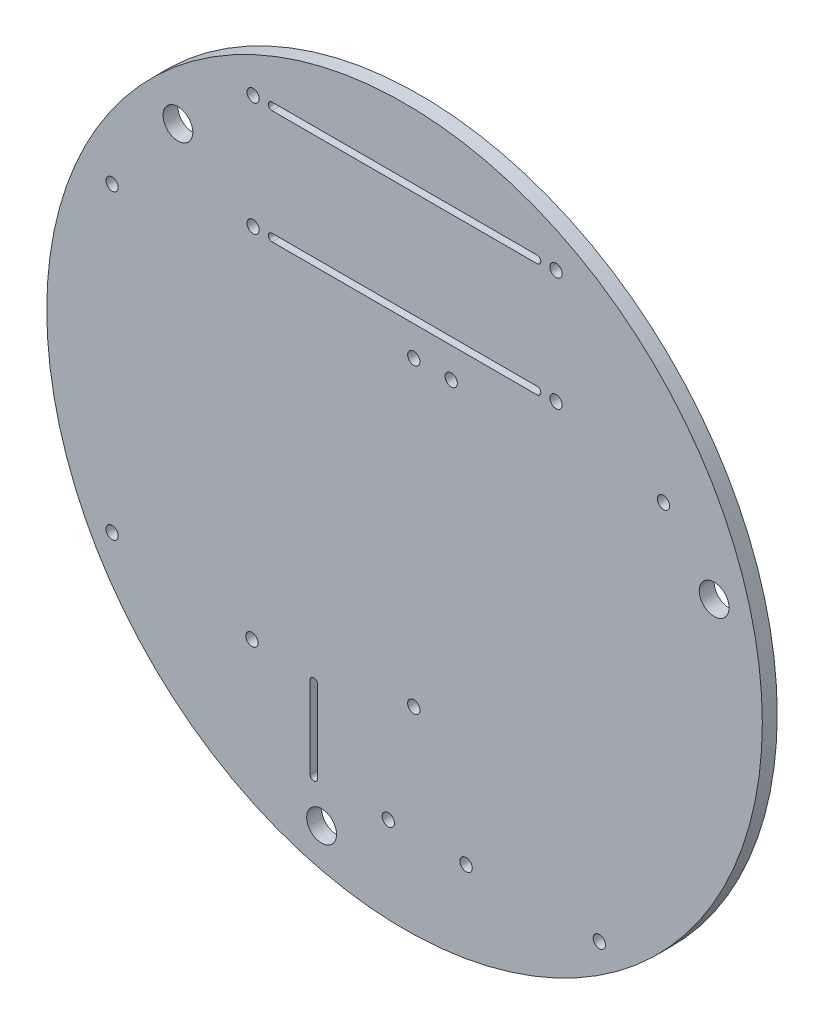
ISO-10303-21;
HEADER;
FILE_DESCRIPTION(('STEP AP214'),'2;1');
FILE_NAME('part.step','',(''),(''),'','','');
FILE_SCHEMA(('AUTOMOTIVE_DESIGN { 1 0 10303 214 1 1 1 1 }'));
ENDSEC;
DATA;
#1=APPLICATION_CONTEXT('core data for automotive mechanical design processes');
#2=APPLICATION_PROTOCOL_DEFINITION('international standard','automotive_design',2000,#1);
#3=PRODUCT_CONTEXT('',#1,'mechanical');
#4=PRODUCT('Part','Part','',(#3));
#5=PRODUCT_RELATED_PRODUCT_CATEGORY('part','',(#4));
#6=PRODUCT_DEFINITION_FORMATION('','',#4);
#7=PRODUCT_DEFINITION_CONTEXT('part definition',#1,'design');
#8=PRODUCT_DEFINITION('design','',#6,#7);
#9=PRODUCT_DEFINITION_SHAPE('','',#8);
#10=(LENGTH_UNIT() NAMED_UNIT(*) SI_UNIT(.MILLI.,.METRE.));
#11=(NAMED_UNIT(*) PLANE_ANGLE_UNIT() SI_UNIT($,.RADIAN.));
#12=(NAMED_UNIT(*) SI_UNIT($,.STERADIAN.) SOLID_ANGLE_UNIT());
#13=UNCERTAINTY_MEASURE_WITH_UNIT(LENGTH_MEASURE(1.E-05),#10,'distance_accuracy_value','');
#14=(GEOMETRIC_REPRESENTATION_CONTEXT(3) GLOBAL_UNCERTAINTY_ASSIGNED_CONTEXT((#13)) GLOBAL_UNIT_ASSIGNED_CONTEXT((#10,
#11,#12)) REPRESENTATION_CONTEXT('',''));
#15=CARTESIAN_POINT('',(0.,0.,0.));
#16=DIRECTION('',(0.,0.,1.));
#17=DIRECTION('',(1.,0.,0.));
#18=AXIS2_PLACEMENT_3D('',#15,#16,#17);
#19=CARTESIAN_POINT('',(0.,0.,2.));
#20=DIRECTION('',(0.,0.,-1.));
#21=DIRECTION('',(-1.,0.,0.));
#22=AXIS2_PLACEMENT_3D('',#19,#20,#21);
#23=CYLINDRICAL_SURFACE('',#22,48.);
#24=CARTESIAN_POINT('',(0.,0.,2.));
#25=DIRECTION('',(0.,0.,1.));
#26=DIRECTION('',(1.,0.,0.));
#27=AXIS2_PLACEMENT_3D('',#24,#25,#26);
#28=CIRCLE('',#27,48.);
#29=CARTESIAN_POINT('',(48.,0.,2.));
#30=VERTEX_POINT('',#29);
#31=EDGE_CURVE('E11',#30,#30,#28,.T.);
#32=ORIENTED_EDGE('',*,*,#31,.F.);
#33=EDGE_LOOP('',(#32));
#34=FACE_BOUND('',#33,.T.);
#35=CARTESIAN_POINT('',(0.,0.,0.));
#36=DIRECTION('',(0.,0.,1.));
#37=DIRECTION('',(1.,0.,0.));
#38=AXIS2_PLACEMENT_3D('',#35,#36,#37);
#39=CIRCLE('',#38,48.);
#40=CARTESIAN_POINT('',(48.,0.,0.));
#41=VERTEX_POINT('',#40);
#42=EDGE_CURVE('E37',#41,#41,#39,.T.);
#43=ORIENTED_EDGE('',*,*,#42,.T.);
#44=EDGE_LOOP('',(#43));
#45=FACE_BOUND('',#44,.T.);
#46=ADVANCED_FACE('F34',(#34,#45),#23,.T.);
#47=CARTESIAN_POINT('',(0.,0.,2.));
#48=DIRECTION('',(0.,0.,1.));
#49=DIRECTION('',(1.,0.,0.));
#50=AXIS2_PLACEMENT_3D('',#47,#48,#49);
#51=PLANE('',#50);
#52=CARTESIAN_POINT('',(-20.48,-24.54,2.));
#53=DIRECTION('',(0.,0.,-1.));
#54=DIRECTION('',(-1.,0.,0.));
#55=AXIS2_PLACEMENT_3D('',#52,#53,#54);
#56=CIRCLE('',#55,0.825000000000001);
#57=CARTESIAN_POINT('',(-21.305,-24.54,2.));
#58=VERTEX_POINT('',#57);
#59=EDGE_CURVE('E153',#58,#58,#56,.T.);
#60=ORIENTED_EDGE('',*,*,#59,.T.);
#61=EDGE_LOOP('',(#60));
#62=FACE_BOUND('',#61,.T.);
#63=CARTESIAN_POINT('',(-12.18,-36.34,2.));
#64=DIRECTION('',(0.,0.,-1.));
#65=DIRECTION('',(-1.,0.,0.));
#66=AXIS2_PLACEMENT_3D('',#63,#64,#65);
#67=CIRCLE('',#66,0.5);
#68=CARTESIAN_POINT('',(-11.68,-36.34,2.));
#69=VERTEX_POINT('',#68);
#70=CARTESIAN_POINT('',(-12.68,-36.34,2.));
#71=VERTEX_POINT('',#70);
#72=EDGE_CURVE('E124',#69,#71,#67,.T.);
#73=ORIENTED_EDGE('',*,*,#72,.T.);
#74=DIRECTION('',(0.,1.,0.));
#75=VECTOR('',#74,1.);
#76=CARTESIAN_POINT('',(-12.68,-36.34,2.));
#77=LINE('',#76,#75);
#78=CARTESIAN_POINT('',(-12.68,-25.34,2.));
#79=VERTEX_POINT('',#78);
#80=EDGE_CURVE('E133',#71,#79,#77,.T.);
#81=ORIENTED_EDGE('',*,*,#80,.T.);
#82=CARTESIAN_POINT('',(-12.18,-25.34,2.));
#83=DIRECTION('',(0.,0.,-1.));
#84=DIRECTION('',(-1.,0.,0.));
#85=AXIS2_PLACEMENT_3D('',#82,#83,#84);
#86=CIRCLE('',#85,0.5);
#87=CARTESIAN_POINT('',(-11.68,-25.34,2.));
#88=VERTEX_POINT('',#87);
#89=EDGE_CURVE('E48',#79,#88,#86,.T.);
#90=ORIENTED_EDGE('',*,*,#89,.T.);
#91=DIRECTION('',(0.,-1.,0.));
#92=VECTOR('',#91,1.);
#93=CARTESIAN_POINT('',(-11.68,-36.34,2.));
#94=LINE('',#93,#92);
#95=EDGE_CURVE('E130',#88,#69,#94,.T.);
#96=ORIENTED_EDGE('',*,*,#95,.T.);
#97=EDGE_LOOP('',(#73,#81,#90,#96));
#98=FACE_BOUND('',#97,.T.);
#99=CARTESIAN_POINT('',(26.13,-36.34,2.));
#100=DIRECTION('',(0.,0.,-1.));
#101=DIRECTION('',(1.,0.,0.));
#102=AXIS2_PLACEMENT_3D('',#99,#100,#101);
#103=CIRCLE('',#102,0.824999999999998);
#104=CARTESIAN_POINT('',(26.955,-36.34,2.));
#105=VERTEX_POINT('',#104);
#106=EDGE_CURVE('E458',#105,#105,#103,.T.);
#107=ORIENTED_EDGE('',*,*,#106,.T.);
#108=EDGE_LOOP('',(#107));
#109=FACE_BOUND('',#108,.T.);
#110=CARTESIAN_POINT('',(-2.18,-36.34,2.));
#111=DIRECTION('',(0.,0.,-1.));
#112=DIRECTION('',(-1.,0.,0.));
#113=AXIS2_PLACEMENT_3D('',#110,#111,#112);
#114=CIRCLE('',#113,0.825);
#115=CARTESIAN_POINT('',(-3.005,-36.34,2.));
#116=VERTEX_POINT('',#115);
#117=EDGE_CURVE('E174',#116,#116,#114,.T.);
#118=ORIENTED_EDGE('',*,*,#117,.T.);
#119=EDGE_LOOP('',(#118));
#120=FACE_BOUND('',#119,.T.);
#121=CARTESIAN_POINT('',(8.26,-36.34,2.));
#122=DIRECTION('',(0.,0.,-1.));
#123=DIRECTION('',(-1.,0.,0.));
#124=AXIS2_PLACEMENT_3D('',#121,#122,#123);
#125=CIRCLE('',#124,0.825);
#126=CARTESIAN_POINT('',(7.435,-36.34,2.));
#127=VERTEX_POINT('',#126);
#128=EDGE_CURVE('E167',#127,#127,#125,.T.);
#129=ORIENTED_EDGE('',*,*,#128,.T.);
#130=EDGE_LOOP('',(#129));
#131=FACE_BOUND('',#130,.T.);
#132=CARTESIAN_POINT('',(6.25999999999999,18.98,2.));
#133=DIRECTION('',(0.,0.,1.));
#134=DIRECTION('',(-1.,0.,0.));
#135=AXIS2_PLACEMENT_3D('',#132,#133,#134);
#136=CIRCLE('',#135,0.825000000000001);
#137=CARTESIAN_POINT('',(5.43499999999999,18.98,2.));
#138=VERTEX_POINT('',#137);
#139=EDGE_CURVE('E261',#138,#138,#136,.T.);
#140=ORIENTED_EDGE('',*,*,#139,.F.);
#141=EDGE_LOOP('',(#140));
#142=FACE_BOUND('',#141,.T.);
#143=CARTESIAN_POINT('',(-39.24,18.98,2.));
#144=DIRECTION('',(0.,0.,1.));
#145=DIRECTION('',(1.,0.,0.));
#146=AXIS2_PLACEMENT_3D('',#143,#144,#145);
#147=CIRCLE('',#146,0.825000000000001);
#148=CARTESIAN_POINT('',(-38.415,18.98,2.));
#149=VERTEX_POINT('',#148);
#150=EDGE_CURVE('E248',#149,#149,#147,.T.);
#151=ORIENTED_EDGE('',*,*,#150,.F.);
#152=EDGE_LOOP('',(#151));
#153=FACE_BOUND('',#152,.T.);
#154=CARTESIAN_POINT('',(1.24000000000001,18.98,2.));
#155=DIRECTION('',(0.,0.,1.));
#156=DIRECTION('',(-1.,0.,0.));
#157=AXIS2_PLACEMENT_3D('',#154,#155,#156);
#158=CIRCLE('',#157,0.825000000000001);
#159=CARTESIAN_POINT('',(0.415000000000004,18.98,2.));
#160=VERTEX_POINT('',#159);
#161=EDGE_CURVE('E249',#160,#160,#158,.T.);
#162=ORIENTED_EDGE('',*,*,#161,.F.);
#163=EDGE_LOOP('',(#162));
#164=FACE_BOUND('',#163,.T.);
#165=CARTESIAN_POINT('',(1.24000000000001,-21.5,2.));
#166=DIRECTION('',(0.,0.,1.));
#167=DIRECTION('',(1.,0.,0.));
#168=AXIS2_PLACEMENT_3D('',#165,#166,#167);
#169=CIRCLE('',#168,0.825000000000001);
#170=CARTESIAN_POINT('',(2.06500000000001,-21.5,2.));
#171=VERTEX_POINT('',#170);
#172=EDGE_CURVE('E178',#171,#171,#169,.T.);
#173=ORIENTED_EDGE('',*,*,#172,.F.);
#174=EDGE_LOOP('',(#173));
#175=FACE_BOUND('',#174,.T.);
#176=CARTESIAN_POINT('',(20.32,23.5,2.));
#177=DIRECTION('',(0.,0.,1.));
#178=DIRECTION('',(-1.,0.,0.));
#179=AXIS2_PLACEMENT_3D('',#176,#177,#178);
#180=CIRCLE('',#179,0.825000000000001);
#181=CARTESIAN_POINT('',(19.495,23.5,2.));
#182=VERTEX_POINT('',#181);
#183=EDGE_CURVE('E285',#182,#182,#180,.T.);
#184=ORIENTED_EDGE('',*,*,#183,.F.);
#185=EDGE_LOOP('',(#184));
#186=FACE_BOUND('',#185,.T.);
#187=CARTESIAN_POINT('',(-20.32,23.5,2.));
#188=DIRECTION('',(0.,0.,1.));
#189=DIRECTION('',(1.,0.,0.));
#190=AXIS2_PLACEMENT_3D('',#187,#188,#189);
#191=CIRCLE('',#190,0.825000000000001);
#192=CARTESIAN_POINT('',(-19.495,23.5,2.));
#193=VERTEX_POINT('',#192);
#194=EDGE_CURVE('E272',#193,#193,#191,.T.);
#195=ORIENTED_EDGE('',*,*,#194,.F.);
#196=EDGE_LOOP('',(#195));
#197=FACE_BOUND('',#196,.T.);
#198=CARTESIAN_POINT('',(-20.32,38.74,2.));
#199=DIRECTION('',(0.,0.,1.));
#200=DIRECTION('',(-1.,0.,0.));
#201=AXIS2_PLACEMENT_3D('',#198,#199,#200);
#202=CIRCLE('',#201,0.825000000000001);
#203=CARTESIAN_POINT('',(-21.145,38.74,2.));
#204=VERTEX_POINT('',#203);
#205=EDGE_CURVE('E273',#204,#204,#202,.T.);
#206=ORIENTED_EDGE('',*,*,#205,.F.);
#207=EDGE_LOOP('',(#206));
#208=FACE_BOUND('',#207,.T.);
#209=CARTESIAN_POINT('',(34.74,18.98,2.));
#210=DIRECTION('',(0.,0.,1.));
#211=DIRECTION('',(1.,0.,0.));
#212=AXIS2_PLACEMENT_3D('',#209,#210,#211);
#213=CIRCLE('',#212,0.825000000000001);
#214=CARTESIAN_POINT('',(35.565,18.98,2.));
#215=VERTEX_POINT('',#214);
#216=EDGE_CURVE('E260',#215,#215,#213,.T.);
#217=ORIENTED_EDGE('',*,*,#216,.F.);
#218=EDGE_LOOP('',(#217));
#219=FACE_BOUND('',#218,.T.);
#220=CARTESIAN_POINT('',(-39.24,-21.5,2.));
#221=DIRECTION('',(0.,0.,1.));
#222=DIRECTION('',(-1.,0.,0.));
#223=AXIS2_PLACEMENT_3D('',#220,#221,#222);
#224=CIRCLE('',#223,0.825000000000001);
#225=CARTESIAN_POINT('',(-40.065,-21.5,2.));
#226=VERTEX_POINT('',#225);
#227=EDGE_CURVE('E179',#226,#226,#224,.T.);
#228=ORIENTED_EDGE('',*,*,#227,.F.);
#229=EDGE_LOOP('',(#228));
#230=FACE_BOUND('',#229,.T.);
#231=CARTESIAN_POINT('',(17.78,23.5,2.));
#232=DIRECTION('',(0.,0.,1.));
#233=DIRECTION('',(1.,0.,0.));
#234=AXIS2_PLACEMENT_3D('',#231,#232,#233);
#235=CIRCLE('',#234,0.499999999999997);
#236=CARTESIAN_POINT('',(17.78,23.,2.));
#237=VERTEX_POINT('',#236);
#238=CARTESIAN_POINT('',(17.78,24.,2.));
#239=VERTEX_POINT('',#238);
#240=EDGE_CURVE('E197',#237,#239,#235,.T.);
#241=ORIENTED_EDGE('',*,*,#240,.F.);
#242=DIRECTION('',(1.,0.,0.));
#243=VECTOR('',#242,1.);
#244=CARTESIAN_POINT('',(17.78,23.,2.));
#245=LINE('',#244,#243);
#246=CARTESIAN_POINT('',(-17.78,23.,2.));
#247=VERTEX_POINT('',#246);
#248=EDGE_CURVE('E187',#247,#237,#245,.T.);
#249=ORIENTED_EDGE('',*,*,#248,.F.);
#250=CARTESIAN_POINT('',(-17.78,23.5,2.));
#251=DIRECTION('',(0.,0.,1.));
#252=DIRECTION('',(1.,0.,0.));
#253=AXIS2_PLACEMENT_3D('',#250,#251,#252);
#254=CIRCLE('',#253,0.500000000000002);
#255=CARTESIAN_POINT('',(-17.78,24.,2.));
#256=VERTEX_POINT('',#255);
#257=EDGE_CURVE('E203',#256,#247,#254,.T.);
#258=ORIENTED_EDGE('',*,*,#257,.F.);
#259=DIRECTION('',(-1.,0.,0.));
#260=VECTOR('',#259,1.);
#261=CARTESIAN_POINT('',(17.78,24.,2.));
#262=LINE('',#261,#260);
#263=EDGE_CURVE('E199',#239,#256,#262,.T.);
#264=ORIENTED_EDGE('',*,*,#263,.F.);
#265=EDGE_LOOP('',(#241,#249,#258,#264));
#266=FACE_BOUND('',#265,.T.);
#267=CARTESIAN_POINT('',(17.78,38.74,2.));
#268=DIRECTION('',(0.,0.,1.));
#269=DIRECTION('',(-1.,0.,0.));
#270=AXIS2_PLACEMENT_3D('',#267,#268,#269);
#271=CIRCLE('',#270,0.5);
#272=CARTESIAN_POINT('',(17.78,38.24,2.));
#273=VERTEX_POINT('',#272);
#274=CARTESIAN_POINT('',(17.78,39.24,2.));
#275=VERTEX_POINT('',#274);
#276=EDGE_CURVE('E170',#273,#275,#271,.T.);
#277=ORIENTED_EDGE('',*,*,#276,.F.);
#278=DIRECTION('',(1.,0.,0.));
#279=VECTOR('',#278,1.);
#280=CARTESIAN_POINT('',(17.78,38.24,2.));
#281=LINE('',#280,#279);
#282=CARTESIAN_POINT('',(-17.78,38.24,2.));
#283=VERTEX_POINT('',#282);
#284=EDGE_CURVE('E219',#283,#273,#281,.T.);
#285=ORIENTED_EDGE('',*,*,#284,.F.);
#286=CARTESIAN_POINT('',(-17.78,38.74,2.));
#287=DIRECTION('',(0.,0.,1.));
#288=DIRECTION('',(-1.,0.,0.));
#289=AXIS2_PLACEMENT_3D('',#286,#287,#288);
#290=CIRCLE('',#289,0.5);
#291=CARTESIAN_POINT('',(-17.78,39.24,2.));
#292=VERTEX_POINT('',#291);
#293=EDGE_CURVE('E233',#292,#283,#290,.T.);
#294=ORIENTED_EDGE('',*,*,#293,.F.);
#295=DIRECTION('',(-1.,0.,0.));
#296=VECTOR('',#295,1.);
#297=CARTESIAN_POINT('',(17.78,39.24,2.));
#298=LINE('',#297,#296);
#299=EDGE_CURVE('E230',#275,#292,#298,.T.);
#300=ORIENTED_EDGE('',*,*,#299,.F.);
#301=EDGE_LOOP('',(#277,#285,#294,#300));
#302=FACE_BOUND('',#301,.T.);
#303=CARTESIAN_POINT('',(20.32,38.74,2.));
#304=DIRECTION('',(0.,0.,1.));
#305=DIRECTION('',(1.,0.,0.));
#306=AXIS2_PLACEMENT_3D('',#303,#304,#305);
#307=CIRCLE('',#306,0.825000000000001);
#308=CARTESIAN_POINT('',(21.145,38.74,2.));
#309=VERTEX_POINT('',#308);
#310=EDGE_CURVE('E284',#309,#309,#307,.T.);
#311=ORIENTED_EDGE('',*,*,#310,.F.);
#312=EDGE_LOOP('',(#311));
#313=FACE_BOUND('',#312,.T.);
#314=CARTESIAN_POINT('',(41.5348105304283,11.1292189394104,2.));
#315=DIRECTION('',(0.,0.,-1.));
#316=DIRECTION('',(-1.,0.,0.));
#317=AXIS2_PLACEMENT_3D('',#314,#315,#316);
#318=CIRCLE('',#317,2.);
#319=CARTESIAN_POINT('',(39.5348105304283,11.1292189394104,2.));
#320=VERTEX_POINT('',#319);
#321=EDGE_CURVE('E299',#320,#320,#318,.T.);
#322=ORIENTED_EDGE('',*,*,#321,.T.);
#323=EDGE_LOOP('',(#322));
#324=FACE_BOUND('',#323,.T.);
#325=CARTESIAN_POINT('',(-30.4055915910216,30.4055915910215,2.));
#326=DIRECTION('',(0.,0.,-1.));
#327=DIRECTION('',(-1.,0.,0.));
#328=AXIS2_PLACEMENT_3D('',#325,#326,#327);
#329=CIRCLE('',#328,2.00000000000001);
#330=CARTESIAN_POINT('',(-32.4055915910216,30.4055915910215,2.));
#331=VERTEX_POINT('',#330);
#332=EDGE_CURVE('E308',#331,#331,#329,.T.);
#333=ORIENTED_EDGE('',*,*,#332,.T.);
#334=EDGE_LOOP('',(#333));
#335=FACE_BOUND('',#334,.T.);
#336=CARTESIAN_POINT('',(-11.1292189394084,-41.534810530431,2.));
#337=DIRECTION('',(0.,0.,-1.));
#338=DIRECTION('',(-1.,0.,0.));
#339=AXIS2_PLACEMENT_3D('',#336,#337,#338);
#340=CIRCLE('',#339,2.);
#341=CARTESIAN_POINT('',(-13.1292189394084,-41.534810530431,2.));
#342=VERTEX_POINT('',#341);
#343=EDGE_CURVE('E296',#342,#342,#340,.T.);
#344=ORIENTED_EDGE('',*,*,#343,.T.);
#345=EDGE_LOOP('',(#344));
#346=FACE_BOUND('',#345,.T.);
#347=ORIENTED_EDGE('',*,*,#31,.T.);
#348=EDGE_LOOP('',(#347));
#349=FACE_BOUND('',#348,.T.);
#350=ADVANCED_FACE('F137',(#62,#98,#109,#120,#131,#142,#153,#164,#175,#186,#197,#208,#219,#230,
#266,#302,#313,#324,#335,#346,#349),#51,.T.);
#351=CARTESIAN_POINT('',(0.,0.,0.));
#352=DIRECTION('',(0.,0.,1.));
#353=DIRECTION('',(1.,0.,0.));
#354=AXIS2_PLACEMENT_3D('',#351,#352,#353);
#355=PLANE('',#354);
#356=CARTESIAN_POINT('',(-20.48,-24.54,0.));
#357=DIRECTION('',(0.,0.,-1.));
#358=DIRECTION('',(-1.,0.,0.));
#359=AXIS2_PLACEMENT_3D('',#356,#357,#358);
#360=CIRCLE('',#359,0.825000000000001);
#361=CARTESIAN_POINT('',(-21.305,-24.54,0.));
#362=VERTEX_POINT('',#361);
#363=EDGE_CURVE('E164',#362,#362,#360,.T.);
#364=ORIENTED_EDGE('',*,*,#363,.F.);
#365=EDGE_LOOP('',(#364));
#366=FACE_BOUND('',#365,.T.);
#367=DIRECTION('',(0.,1.,0.));
#368=VECTOR('',#367,1.);
#369=CARTESIAN_POINT('',(-12.68,-36.34,0.));
#370=LINE('',#369,#368);
#371=CARTESIAN_POINT('',(-12.68,-36.34,0.));
#372=VERTEX_POINT('',#371);
#373=CARTESIAN_POINT('',(-12.68,-25.34,0.));
#374=VERTEX_POINT('',#373);
#375=EDGE_CURVE('E152',#372,#374,#370,.T.);
#376=ORIENTED_EDGE('',*,*,#375,.F.);
#377=CARTESIAN_POINT('',(-12.18,-36.34,0.));
#378=DIRECTION('',(0.,0.,-1.));
#379=DIRECTION('',(-1.,0.,0.));
#380=AXIS2_PLACEMENT_3D('',#377,#378,#379);
#381=CIRCLE('',#380,0.5);
#382=CARTESIAN_POINT('',(-11.68,-36.34,0.));
#383=VERTEX_POINT('',#382);
#384=EDGE_CURVE('E56',#383,#372,#381,.T.);
#385=ORIENTED_EDGE('',*,*,#384,.F.);
#386=DIRECTION('',(0.,-1.,0.));
#387=VECTOR('',#386,1.);
#388=CARTESIAN_POINT('',(-11.68,-36.34,0.));
#389=LINE('',#388,#387);
#390=CARTESIAN_POINT('',(-11.68,-25.34,0.));
#391=VERTEX_POINT('',#390);
#392=EDGE_CURVE('E140',#391,#383,#389,.T.);
#393=ORIENTED_EDGE('',*,*,#392,.F.);
#394=CARTESIAN_POINT('',(-12.18,-25.34,0.));
#395=DIRECTION('',(0.,0.,-1.));
#396=DIRECTION('',(-1.,0.,0.));
#397=AXIS2_PLACEMENT_3D('',#394,#395,#396);
#398=CIRCLE('',#397,0.5);
#399=EDGE_CURVE('E143',#374,#391,#398,.T.);
#400=ORIENTED_EDGE('',*,*,#399,.F.);
#401=EDGE_LOOP('',(#376,#385,#393,#400));
#402=FACE_BOUND('',#401,.T.);
#403=CARTESIAN_POINT('',(26.13,-36.34,0.));
#404=DIRECTION('',(0.,0.,-1.));
#405=DIRECTION('',(1.,0.,0.));
#406=AXIS2_PLACEMENT_3D('',#403,#404,#405);
#407=CIRCLE('',#406,0.824999999999998);
#408=CARTESIAN_POINT('',(26.955,-36.34,0.));
#409=VERTEX_POINT('',#408);
#410=EDGE_CURVE('E146',#409,#409,#407,.T.);
#411=ORIENTED_EDGE('',*,*,#410,.F.);
#412=EDGE_LOOP('',(#411));
#413=FACE_BOUND('',#412,.T.);
#414=CARTESIAN_POINT('',(-2.18,-36.34,0.));
#415=DIRECTION('',(0.,0.,-1.));
#416=DIRECTION('',(-1.,0.,0.));
#417=AXIS2_PLACEMENT_3D('',#414,#415,#416);
#418=CIRCLE('',#417,0.825);
#419=CARTESIAN_POINT('',(-3.005,-36.34,0.));
#420=VERTEX_POINT('',#419);
#421=EDGE_CURVE('E456',#420,#420,#418,.T.);
#422=ORIENTED_EDGE('',*,*,#421,.F.);
#423=EDGE_LOOP('',(#422));
#424=FACE_BOUND('',#423,.T.);
#425=CARTESIAN_POINT('',(8.26,-36.34,0.));
#426=DIRECTION('',(0.,0.,-1.));
#427=DIRECTION('',(-1.,0.,0.));
#428=AXIS2_PLACEMENT_3D('',#425,#426,#427);
#429=CIRCLE('',#428,0.825);
#430=CARTESIAN_POINT('',(7.435,-36.34,0.));
#431=VERTEX_POINT('',#430);
#432=EDGE_CURVE('E171',#431,#431,#429,.T.);
#433=ORIENTED_EDGE('',*,*,#432,.F.);
#434=EDGE_LOOP('',(#433));
#435=FACE_BOUND('',#434,.T.);
#436=CARTESIAN_POINT('',(6.25999999999999,18.98,0.));
#437=DIRECTION('',(0.,0.,1.));
#438=DIRECTION('',(-1.,0.,0.));
#439=AXIS2_PLACEMENT_3D('',#436,#437,#438);
#440=CIRCLE('',#439,0.825000000000001);
#441=CARTESIAN_POINT('',(5.43499999999999,18.98,0.));
#442=VERTEX_POINT('',#441);
#443=EDGE_CURVE('E257',#442,#442,#440,.T.);
#444=ORIENTED_EDGE('',*,*,#443,.T.);
#445=EDGE_LOOP('',(#444));
#446=FACE_BOUND('',#445,.T.);
#447=CARTESIAN_POINT('',(-39.24,18.98,0.));
#448=DIRECTION('',(0.,0.,1.));
#449=DIRECTION('',(1.,0.,0.));
#450=AXIS2_PLACEMENT_3D('',#447,#448,#449);
#451=CIRCLE('',#450,0.825000000000001);
#452=CARTESIAN_POINT('',(-38.415,18.98,0.));
#453=VERTEX_POINT('',#452);
#454=EDGE_CURVE('E264',#453,#453,#451,.T.);
#455=ORIENTED_EDGE('',*,*,#454,.T.);
#456=EDGE_LOOP('',(#455));
#457=FACE_BOUND('',#456,.T.);
#458=CARTESIAN_POINT('',(1.24000000000001,18.98,0.));
#459=DIRECTION('',(0.,0.,1.));
#460=DIRECTION('',(-1.,0.,0.));
#461=AXIS2_PLACEMENT_3D('',#458,#459,#460);
#462=CIRCLE('',#461,0.825000000000001);
#463=CARTESIAN_POINT('',(0.415000000000004,18.98,0.));
#464=VERTEX_POINT('',#463);
#465=EDGE_CURVE('E245',#464,#464,#462,.T.);
#466=ORIENTED_EDGE('',*,*,#465,.T.);
#467=EDGE_LOOP('',(#466));
#468=FACE_BOUND('',#467,.T.);
#469=CARTESIAN_POINT('',(1.24000000000001,-21.5,0.));
#470=DIRECTION('',(0.,0.,1.));
#471=DIRECTION('',(1.,0.,0.));
#472=AXIS2_PLACEMENT_3D('',#469,#470,#471);
#473=CIRCLE('',#472,0.825000000000001);
#474=CARTESIAN_POINT('',(2.06500000000001,-21.5,0.));
#475=VERTEX_POINT('',#474);
#476=EDGE_CURVE('E252',#475,#475,#473,.T.);
#477=ORIENTED_EDGE('',*,*,#476,.T.);
#478=EDGE_LOOP('',(#477));
#479=FACE_BOUND('',#478,.T.);
#480=CARTESIAN_POINT('',(20.32,23.5,0.));
#481=DIRECTION('',(0.,0.,1.));
#482=DIRECTION('',(-1.,0.,0.));
#483=AXIS2_PLACEMENT_3D('',#480,#481,#482);
#484=CIRCLE('',#483,0.825000000000001);
#485=CARTESIAN_POINT('',(19.495,23.5,0.));
#486=VERTEX_POINT('',#485);
#487=EDGE_CURVE('E281',#486,#486,#484,.T.);
#488=ORIENTED_EDGE('',*,*,#487,.T.);
#489=EDGE_LOOP('',(#488));
#490=FACE_BOUND('',#489,.T.);
#491=CARTESIAN_POINT('',(-20.32,23.5,0.));
#492=DIRECTION('',(0.,0.,1.));
#493=DIRECTION('',(1.,0.,0.));
#494=AXIS2_PLACEMENT_3D('',#491,#492,#493);
#495=CIRCLE('',#494,0.825000000000001);
#496=CARTESIAN_POINT('',(-19.495,23.5,0.));
#497=VERTEX_POINT('',#496);
#498=EDGE_CURVE('E288',#497,#497,#495,.T.);
#499=ORIENTED_EDGE('',*,*,#498,.T.);
#500=EDGE_LOOP('',(#499));
#501=FACE_BOUND('',#500,.T.);
#502=CARTESIAN_POINT('',(-20.32,38.74,0.));
#503=DIRECTION('',(0.,0.,1.));
#504=DIRECTION('',(-1.,0.,0.));
#505=AXIS2_PLACEMENT_3D('',#502,#503,#504);
#506=CIRCLE('',#505,0.825000000000001);
#507=CARTESIAN_POINT('',(-21.145,38.74,0.));
#508=VERTEX_POINT('',#507);
#509=EDGE_CURVE('E269',#508,#508,#506,.T.);
#510=ORIENTED_EDGE('',*,*,#509,.T.);
#511=EDGE_LOOP('',(#510));
#512=FACE_BOUND('',#511,.T.);
#513=CARTESIAN_POINT('',(34.74,18.98,0.));
#514=DIRECTION('',(0.,0.,1.));
#515=DIRECTION('',(1.,0.,0.));
#516=AXIS2_PLACEMENT_3D('',#513,#514,#515);
#517=CIRCLE('',#516,0.825000000000001);
#518=CARTESIAN_POINT('',(35.565,18.98,0.));
#519=VERTEX_POINT('',#518);
#520=EDGE_CURVE('E276',#519,#519,#517,.T.);
#521=ORIENTED_EDGE('',*,*,#520,.T.);
#522=EDGE_LOOP('',(#521));
#523=FACE_BOUND('',#522,.T.);
#524=CARTESIAN_POINT('',(-39.24,-21.5,0.));
#525=DIRECTION('',(0.,0.,1.));
#526=DIRECTION('',(-1.,0.,0.));
#527=AXIS2_PLACEMENT_3D('',#524,#525,#526);
#528=CIRCLE('',#527,0.825000000000001);
#529=CARTESIAN_POINT('',(-40.065,-21.5,0.));
#530=VERTEX_POINT('',#529);
#531=EDGE_CURVE('E175',#530,#530,#528,.T.);
#532=ORIENTED_EDGE('',*,*,#531,.T.);
#533=EDGE_LOOP('',(#532));
#534=FACE_BOUND('',#533,.T.);
#535=DIRECTION('',(1.,0.,0.));
#536=VECTOR('',#535,1.);
#537=CARTESIAN_POINT('',(17.78,23.,0.));
#538=LINE('',#537,#536);
#539=CARTESIAN_POINT('',(-17.78,23.,0.));
#540=VERTEX_POINT('',#539);
#541=CARTESIAN_POINT('',(17.78,23.,0.));
#542=VERTEX_POINT('',#541);
#543=EDGE_CURVE('E193',#540,#542,#538,.T.);
#544=ORIENTED_EDGE('',*,*,#543,.T.);
#545=CARTESIAN_POINT('',(17.78,23.5,0.));
#546=DIRECTION('',(0.,0.,1.));
#547=DIRECTION('',(1.,0.,0.));
#548=AXIS2_PLACEMENT_3D('',#545,#546,#547);
#549=CIRCLE('',#548,0.499999999999997);
#550=CARTESIAN_POINT('',(17.78,24.,0.));
#551=VERTEX_POINT('',#550);
#552=EDGE_CURVE('E183',#542,#551,#549,.T.);
#553=ORIENTED_EDGE('',*,*,#552,.T.);
#554=DIRECTION('',(-1.,0.,0.));
#555=VECTOR('',#554,1.);
#556=CARTESIAN_POINT('',(17.78,24.,0.));
#557=LINE('',#556,#555);
#558=CARTESIAN_POINT('',(-17.78,24.,0.));
#559=VERTEX_POINT('',#558);
#560=EDGE_CURVE('E186',#551,#559,#557,.T.);
#561=ORIENTED_EDGE('',*,*,#560,.T.);
#562=CARTESIAN_POINT('',(-17.78,23.5,0.));
#563=DIRECTION('',(0.,0.,1.));
#564=DIRECTION('',(1.,0.,0.));
#565=AXIS2_PLACEMENT_3D('',#562,#563,#564);
#566=CIRCLE('',#565,0.500000000000002);
#567=EDGE_CURVE('E190',#559,#540,#566,.T.);
#568=ORIENTED_EDGE('',*,*,#567,.T.);
#569=EDGE_LOOP('',(#544,#553,#561,#568));
#570=FACE_BOUND('',#569,.T.);
#571=DIRECTION('',(1.,0.,0.));
#572=VECTOR('',#571,1.);
#573=CARTESIAN_POINT('',(17.78,38.24,0.));
#574=LINE('',#573,#572);
#575=CARTESIAN_POINT('',(-17.78,38.24,0.));
#576=VERTEX_POINT('',#575);
#577=CARTESIAN_POINT('',(17.78,38.24,0.));
#578=VERTEX_POINT('',#577);
#579=EDGE_CURVE('E225',#576,#578,#574,.T.);
#580=ORIENTED_EDGE('',*,*,#579,.T.);
#581=CARTESIAN_POINT('',(17.78,38.74,0.));
#582=DIRECTION('',(0.,0.,1.));
#583=DIRECTION('',(-1.,0.,0.));
#584=AXIS2_PLACEMENT_3D('',#581,#582,#583);
#585=CIRCLE('',#584,0.5);
#586=CARTESIAN_POINT('',(17.78,39.24,0.));
#587=VERTEX_POINT('',#586);
#588=EDGE_CURVE('E215',#578,#587,#585,.T.);
#589=ORIENTED_EDGE('',*,*,#588,.T.);
#590=DIRECTION('',(-1.,0.,0.));
#591=VECTOR('',#590,1.);
#592=CARTESIAN_POINT('',(17.78,39.24,0.));
#593=LINE('',#592,#591);
#594=CARTESIAN_POINT('',(-17.78,39.24,0.));
#595=VERTEX_POINT('',#594);
#596=EDGE_CURVE('E218',#587,#595,#593,.T.);
#597=ORIENTED_EDGE('',*,*,#596,.T.);
#598=CARTESIAN_POINT('',(-17.78,38.74,0.));
#599=DIRECTION('',(0.,0.,1.));
#600=DIRECTION('',(-1.,0.,0.));
#601=AXIS2_PLACEMENT_3D('',#598,#599,#600);
#602=CIRCLE('',#601,0.5);
#603=EDGE_CURVE('E222',#595,#576,#602,.T.);
#604=ORIENTED_EDGE('',*,*,#603,.T.);
#605=EDGE_LOOP('',(#580,#589,#597,#604));
#606=FACE_BOUND('',#605,.T.);
#607=CARTESIAN_POINT('',(20.32,38.74,0.));
#608=DIRECTION('',(0.,0.,1.));
#609=DIRECTION('',(1.,0.,0.));
#610=AXIS2_PLACEMENT_3D('',#607,#608,#609);
#611=CIRCLE('',#610,0.825000000000001);
#612=CARTESIAN_POINT('',(21.145,38.74,0.));
#613=VERTEX_POINT('',#612);
#614=EDGE_CURVE('E293',#613,#613,#611,.T.);
#615=ORIENTED_EDGE('',*,*,#614,.T.);
#616=EDGE_LOOP('',(#615));
#617=FACE_BOUND('',#616,.T.);
#618=CARTESIAN_POINT('',(41.5348105304283,11.1292189394104,0.));
#619=DIRECTION('',(0.,0.,-1.));
#620=DIRECTION('',(-1.,0.,0.));
#621=AXIS2_PLACEMENT_3D('',#618,#619,#620);
#622=CIRCLE('',#621,2.);
#623=CARTESIAN_POINT('',(39.5348105304283,11.1292189394104,0.));
#624=VERTEX_POINT('',#623);
#625=EDGE_CURVE('E302',#624,#624,#622,.T.);
#626=ORIENTED_EDGE('',*,*,#625,.F.);
#627=EDGE_LOOP('',(#626));
#628=FACE_BOUND('',#627,.T.);
#629=CARTESIAN_POINT('',(-30.4055915910216,30.4055915910215,0.));
#630=DIRECTION('',(0.,0.,-1.));
#631=DIRECTION('',(-1.,0.,0.));
#632=AXIS2_PLACEMENT_3D('',#629,#630,#631);
#633=CIRCLE('',#632,2.00000000000001);
#634=CARTESIAN_POINT('',(-32.4055915910216,30.4055915910215,0.));
#635=VERTEX_POINT('',#634);
#636=EDGE_CURVE('E305',#635,#635,#633,.T.);
#637=ORIENTED_EDGE('',*,*,#636,.F.);
#638=EDGE_LOOP('',(#637));
#639=FACE_BOUND('',#638,.T.);
#640=CARTESIAN_POINT('',(-11.1292189394084,-41.534810530431,0.));
#641=DIRECTION('',(0.,0.,-1.));
#642=DIRECTION('',(-1.,0.,0.));
#643=AXIS2_PLACEMENT_3D('',#640,#641,#642);
#644=CIRCLE('',#643,2.);
#645=CARTESIAN_POINT('',(-13.1292189394084,-41.534810530431,0.));
#646=VERTEX_POINT('',#645);
#647=EDGE_CURVE('E311',#646,#646,#644,.T.);
#648=ORIENTED_EDGE('',*,*,#647,.F.);
#649=EDGE_LOOP('',(#648));
#650=FACE_BOUND('',#649,.T.);
#651=ORIENTED_EDGE('',*,*,#42,.F.);
#652=EDGE_LOOP('',(#651));
#653=FACE_BOUND('',#652,.T.);
#654=ADVANCED_FACE('F323',(#366,#402,#413,#424,#435,#446,#457,#468,#479,#490,#501,#512,#523,
#534,#570,#606,#617,#628,#639,#650,#653),#355,.F.);
#655=CARTESIAN_POINT('',(-11.1292189394084,-41.534810530431,2.));
#656=DIRECTION('',(0.,0.,-1.));
#657=DIRECTION('',(-1.,0.,0.));
#658=AXIS2_PLACEMENT_3D('',#655,#656,#657);
#659=CYLINDRICAL_SURFACE('',#658,2.);
#660=ORIENTED_EDGE('',*,*,#343,.F.);
#661=EDGE_LOOP('',(#660));
#662=FACE_BOUND('',#661,.T.);
#663=ORIENTED_EDGE('',*,*,#647,.T.);
#664=EDGE_LOOP('',(#663));
#665=FACE_BOUND('',#664,.T.);
#666=ADVANCED_FACE('F319',(#662,#665),#659,.F.);
#667=CARTESIAN_POINT('',(-30.4055915910216,30.4055915910215,2.));
#668=DIRECTION('',(0.,0.,-1.));
#669=DIRECTION('',(-1.,0.,0.));
#670=AXIS2_PLACEMENT_3D('',#667,#668,#669);
#671=CYLINDRICAL_SURFACE('',#670,2.00000000000001);
#672=ORIENTED_EDGE('',*,*,#332,.F.);
#673=EDGE_LOOP('',(#672));
#674=FACE_BOUND('',#673,.T.);
#675=ORIENTED_EDGE('',*,*,#636,.T.);
#676=EDGE_LOOP('',(#675));
#677=FACE_BOUND('',#676,.T.);
#678=ADVANCED_FACE('F322',(#674,#677),#671,.F.);
#679=CARTESIAN_POINT('',(41.5348105304283,11.1292189394104,2.));
#680=DIRECTION('',(0.,0.,-1.));
#681=DIRECTION('',(-1.,0.,0.));
#682=AXIS2_PLACEMENT_3D('',#679,#680,#681);
#683=CYLINDRICAL_SURFACE('',#682,2.);
#684=ORIENTED_EDGE('',*,*,#321,.F.);
#685=EDGE_LOOP('',(#684));
#686=FACE_BOUND('',#685,.T.);
#687=ORIENTED_EDGE('',*,*,#625,.T.);
#688=EDGE_LOOP('',(#687));
#689=FACE_BOUND('',#688,.T.);
#690=ADVANCED_FACE('F346',(#686,#689),#683,.F.);
#691=CARTESIAN_POINT('',(20.32,38.74,0.));
#692=DIRECTION('',(0.,0.,1.));
#693=DIRECTION('',(1.,0.,0.));
#694=AXIS2_PLACEMENT_3D('',#691,#692,#693);
#695=CYLINDRICAL_SURFACE('',#694,0.825000000000001);
#696=ORIENTED_EDGE('',*,*,#614,.F.);
#697=EDGE_LOOP('',(#696));
#698=FACE_BOUND('',#697,.T.);
#699=ORIENTED_EDGE('',*,*,#310,.T.);
#700=EDGE_LOOP('',(#699));
#701=FACE_BOUND('',#700,.T.);
#702=ADVANCED_FACE('F350',(#698,#701),#695,.F.);
#703=CARTESIAN_POINT('',(17.78,38.74,0.));
#704=DIRECTION('',(0.,0.,1.));
#705=DIRECTION('',(1.,0.,0.));
#706=AXIS2_PLACEMENT_3D('',#703,#704,#705);
#707=CYLINDRICAL_SURFACE('',#706,0.5);
#708=ORIENTED_EDGE('',*,*,#276,.T.);
#709=DIRECTION('',(0.,0.,1.));
#710=VECTOR('',#709,1.);
#711=CARTESIAN_POINT('',(17.78,39.24,0.));
#712=LINE('',#711,#710);
#713=EDGE_CURVE('E228',#587,#275,#712,.T.);
#714=ORIENTED_EDGE('',*,*,#713,.F.);
#715=ORIENTED_EDGE('',*,*,#588,.F.);
#716=DIRECTION('',(0.,0.,1.));
#717=VECTOR('',#716,1.);
#718=CARTESIAN_POINT('',(17.78,38.24,0.));
#719=LINE('',#718,#717);
#720=EDGE_CURVE('E200',#578,#273,#719,.T.);
#721=ORIENTED_EDGE('',*,*,#720,.T.);
#722=EDGE_LOOP('',(#708,#714,#715,#721));
#723=FACE_BOUND('',#722,.T.);
#724=ADVANCED_FACE('F354',(#723),#707,.F.);
#725=CARTESIAN_POINT('',(17.78,38.24,0.));
#726=DIRECTION('',(0.,-1.,0.));
#727=DIRECTION('',(0.,0.,-1.));
#728=AXIS2_PLACEMENT_3D('',#725,#726,#727);
#729=PLANE('',#728);
#730=ORIENTED_EDGE('',*,*,#284,.T.);
#731=ORIENTED_EDGE('',*,*,#720,.F.);
#732=ORIENTED_EDGE('',*,*,#579,.F.);
#733=DIRECTION('',(0.,0.,1.));
#734=VECTOR('',#733,1.);
#735=CARTESIAN_POINT('',(-17.78,38.24,0.));
#736=LINE('',#735,#734);
#737=EDGE_CURVE('E239',#576,#283,#736,.T.);
#738=ORIENTED_EDGE('',*,*,#737,.T.);
#739=EDGE_LOOP('',(#730,#731,#732,#738));
#740=FACE_BOUND('',#739,.T.);
#741=ADVANCED_FACE('F392',(#740),#729,.F.);
#742=CARTESIAN_POINT('',(-17.78,38.74,0.));
#743=DIRECTION('',(0.,0.,1.));
#744=DIRECTION('',(1.,0.,0.));
#745=AXIS2_PLACEMENT_3D('',#742,#743,#744);
#746=CYLINDRICAL_SURFACE('',#745,0.5);
#747=ORIENTED_EDGE('',*,*,#293,.T.);
#748=ORIENTED_EDGE('',*,*,#737,.F.);
#749=ORIENTED_EDGE('',*,*,#603,.F.);
#750=DIRECTION('',(0.,0.,1.));
#751=VECTOR('',#750,1.);
#752=CARTESIAN_POINT('',(-17.78,39.24,0.));
#753=LINE('',#752,#751);
#754=EDGE_CURVE('E241',#595,#292,#753,.T.);
#755=ORIENTED_EDGE('',*,*,#754,.T.);
#756=EDGE_LOOP('',(#747,#748,#749,#755));
#757=FACE_BOUND('',#756,.T.);
#758=ADVANCED_FACE('F398',(#757),#746,.F.);
#759=CARTESIAN_POINT('',(17.78,39.24,0.));
#760=DIRECTION('',(0.,1.,0.));
#761=DIRECTION('',(0.,0.,1.));
#762=AXIS2_PLACEMENT_3D('',#759,#760,#761);
#763=PLANE('',#762);
#764=ORIENTED_EDGE('',*,*,#299,.T.);
#765=ORIENTED_EDGE('',*,*,#754,.F.);
#766=ORIENTED_EDGE('',*,*,#596,.F.);
#767=ORIENTED_EDGE('',*,*,#713,.T.);
#768=EDGE_LOOP('',(#764,#765,#766,#767));
#769=FACE_BOUND('',#768,.T.);
#770=ADVANCED_FACE('F394',(#769),#763,.F.);
#771=CARTESIAN_POINT('',(17.78,23.5,0.));
#772=DIRECTION('',(0.,0.,1.));
#773=DIRECTION('',(1.,0.,0.));
#774=AXIS2_PLACEMENT_3D('',#771,#772,#773);
#775=CYLINDRICAL_SURFACE('',#774,0.499999999999997);
#776=ORIENTED_EDGE('',*,*,#240,.T.);
#777=DIRECTION('',(0.,0.,1.));
#778=VECTOR('',#777,1.);
#779=CARTESIAN_POINT('',(17.78,24.,0.));
#780=LINE('',#779,#778);
#781=EDGE_CURVE('E196',#551,#239,#780,.T.);
#782=ORIENTED_EDGE('',*,*,#781,.F.);
#783=ORIENTED_EDGE('',*,*,#552,.F.);
#784=DIRECTION('',(0.,0.,1.));
#785=VECTOR('',#784,1.);
#786=CARTESIAN_POINT('',(17.78,23.,0.));
#787=LINE('',#786,#785);
#788=EDGE_CURVE('E182',#542,#237,#787,.T.);
#789=ORIENTED_EDGE('',*,*,#788,.T.);
#790=EDGE_LOOP('',(#776,#782,#783,#789));
#791=FACE_BOUND('',#790,.T.);
#792=ADVANCED_FACE('F397',(#791),#775,.F.);
#793=CARTESIAN_POINT('',(17.78,23.,0.));
#794=DIRECTION('',(0.,-1.,0.));
#795=DIRECTION('',(1.,0.,0.));
#796=AXIS2_PLACEMENT_3D('',#793,#794,#795);
#797=PLANE('',#796);
#798=ORIENTED_EDGE('',*,*,#248,.T.);
#799=ORIENTED_EDGE('',*,*,#788,.F.);
#800=ORIENTED_EDGE('',*,*,#543,.F.);
#801=DIRECTION('',(0.,0.,1.));
#802=VECTOR('',#801,1.);
#803=CARTESIAN_POINT('',(-17.78,23.,0.));
#804=LINE('',#803,#802);
#805=EDGE_CURVE('E209',#540,#247,#804,.T.);
#806=ORIENTED_EDGE('',*,*,#805,.T.);
#807=EDGE_LOOP('',(#798,#799,#800,#806));
#808=FACE_BOUND('',#807,.T.);
#809=ADVANCED_FACE('F408',(#808),#797,.F.);
#810=CARTESIAN_POINT('',(-17.78,23.5,0.));
#811=DIRECTION('',(0.,0.,1.));
#812=DIRECTION('',(1.,0.,0.));
#813=AXIS2_PLACEMENT_3D('',#810,#811,#812);
#814=CYLINDRICAL_SURFACE('',#813,0.500000000000002);
#815=ORIENTED_EDGE('',*,*,#257,.T.);
#816=ORIENTED_EDGE('',*,*,#805,.F.);
#817=ORIENTED_EDGE('',*,*,#567,.F.);
#818=DIRECTION('',(0.,0.,1.));
#819=VECTOR('',#818,1.);
#820=CARTESIAN_POINT('',(-17.78,24.,0.));
#821=LINE('',#820,#819);
#822=EDGE_CURVE('E211',#559,#256,#821,.T.);
#823=ORIENTED_EDGE('',*,*,#822,.T.);
#824=EDGE_LOOP('',(#815,#816,#817,#823));
#825=FACE_BOUND('',#824,.T.);
#826=ADVANCED_FACE('F413',(#825),#814,.F.);
#827=CARTESIAN_POINT('',(17.78,24.,0.));
#828=DIRECTION('',(0.,1.,0.));
#829=DIRECTION('',(-1.,0.,0.));
#830=AXIS2_PLACEMENT_3D('',#827,#828,#829);
#831=PLANE('',#830);
#832=ORIENTED_EDGE('',*,*,#263,.T.);
#833=ORIENTED_EDGE('',*,*,#822,.F.);
#834=ORIENTED_EDGE('',*,*,#560,.F.);
#835=ORIENTED_EDGE('',*,*,#781,.T.);
#836=EDGE_LOOP('',(#832,#833,#834,#835));
#837=FACE_BOUND('',#836,.T.);
#838=ADVANCED_FACE('F410',(#837),#831,.F.);
#839=CARTESIAN_POINT('',(-39.24,-21.5,0.));
#840=DIRECTION('',(0.,0.,1.));
#841=DIRECTION('',(1.,0.,0.));
#842=AXIS2_PLACEMENT_3D('',#839,#840,#841);
#843=CYLINDRICAL_SURFACE('',#842,0.825000000000001);
#844=ORIENTED_EDGE('',*,*,#531,.F.);
#845=EDGE_LOOP('',(#844));
#846=FACE_BOUND('',#845,.T.);
#847=ORIENTED_EDGE('',*,*,#227,.T.);
#848=EDGE_LOOP('',(#847));
#849=FACE_BOUND('',#848,.T.);
#850=ADVANCED_FACE('F369',(#846,#849),#843,.F.);
#851=CARTESIAN_POINT('',(34.74,18.98,0.));
#852=DIRECTION('',(0.,0.,1.));
#853=DIRECTION('',(1.,0.,0.));
#854=AXIS2_PLACEMENT_3D('',#851,#852,#853);
#855=CYLINDRICAL_SURFACE('',#854,0.825000000000001);
#856=ORIENTED_EDGE('',*,*,#520,.F.);
#857=EDGE_LOOP('',(#856));
#858=FACE_BOUND('',#857,.T.);
#859=ORIENTED_EDGE('',*,*,#216,.T.);
#860=EDGE_LOOP('',(#859));
#861=FACE_BOUND('',#860,.T.);
#862=ADVANCED_FACE('F366',(#858,#861),#855,.F.);
#863=CARTESIAN_POINT('',(-20.32,38.74,0.));
#864=DIRECTION('',(0.,0.,1.));
#865=DIRECTION('',(1.,0.,0.));
#866=AXIS2_PLACEMENT_3D('',#863,#864,#865);
#867=CYLINDRICAL_SURFACE('',#866,0.825000000000001);
#868=ORIENTED_EDGE('',*,*,#509,.F.);
#869=EDGE_LOOP('',(#868));
#870=FACE_BOUND('',#869,.T.);
#871=ORIENTED_EDGE('',*,*,#205,.T.);
#872=EDGE_LOOP('',(#871));
#873=FACE_BOUND('',#872,.T.);
#874=ADVANCED_FACE('F360',(#870,#873),#867,.F.);
#875=CARTESIAN_POINT('',(-20.32,23.5,0.));
#876=DIRECTION('',(0.,0.,1.));
#877=DIRECTION('',(1.,0.,0.));
#878=AXIS2_PLACEMENT_3D('',#875,#876,#877);
#879=CYLINDRICAL_SURFACE('',#878,0.825000000000001);
#880=ORIENTED_EDGE('',*,*,#498,.F.);
#881=EDGE_LOOP('',(#880));
#882=FACE_BOUND('',#881,.T.);
#883=ORIENTED_EDGE('',*,*,#194,.T.);
#884=EDGE_LOOP('',(#883));
#885=FACE_BOUND('',#884,.T.);
#886=ADVANCED_FACE('F356',(#882,#885),#879,.F.);
#887=CARTESIAN_POINT('',(20.32,23.5,0.));
#888=DIRECTION('',(0.,0.,1.));
#889=DIRECTION('',(1.,0.,0.));
#890=AXIS2_PLACEMENT_3D('',#887,#888,#889);
#891=CYLINDRICAL_SURFACE('',#890,0.825000000000001);
#892=ORIENTED_EDGE('',*,*,#487,.F.);
#893=EDGE_LOOP('',(#892));
#894=FACE_BOUND('',#893,.T.);
#895=ORIENTED_EDGE('',*,*,#183,.T.);
#896=EDGE_LOOP('',(#895));
#897=FACE_BOUND('',#896,.T.);
#898=ADVANCED_FACE('F359',(#894,#897),#891,.F.);
#899=CARTESIAN_POINT('',(1.24000000000001,-21.5,0.));
#900=DIRECTION('',(0.,0.,1.));
#901=DIRECTION('',(1.,0.,0.));
#902=AXIS2_PLACEMENT_3D('',#899,#900,#901);
#903=CYLINDRICAL_SURFACE('',#902,0.825000000000001);
#904=ORIENTED_EDGE('',*,*,#476,.F.);
#905=EDGE_LOOP('',(#904));
#906=FACE_BOUND('',#905,.T.);
#907=ORIENTED_EDGE('',*,*,#172,.T.);
#908=EDGE_LOOP('',(#907));
#909=FACE_BOUND('',#908,.T.);
#910=ADVANCED_FACE('F364',(#906,#909),#903,.F.);
#911=CARTESIAN_POINT('',(1.24000000000001,18.98,0.));
#912=DIRECTION('',(0.,0.,1.));
#913=DIRECTION('',(1.,0.,0.));
#914=AXIS2_PLACEMENT_3D('',#911,#912,#913);
#915=CYLINDRICAL_SURFACE('',#914,0.825000000000001);
#916=ORIENTED_EDGE('',*,*,#465,.F.);
#917=EDGE_LOOP('',(#916));
#918=FACE_BOUND('',#917,.T.);
#919=ORIENTED_EDGE('',*,*,#161,.T.);
#920=EDGE_LOOP('',(#919));
#921=FACE_BOUND('',#920,.T.);
#922=ADVANCED_FACE('F378',(#918,#921),#915,.F.);
#923=CARTESIAN_POINT('',(-39.24,18.98,0.));
#924=DIRECTION('',(0.,0.,1.));
#925=DIRECTION('',(1.,0.,0.));
#926=AXIS2_PLACEMENT_3D('',#923,#924,#925);
#927=CYLINDRICAL_SURFACE('',#926,0.825000000000001);
#928=ORIENTED_EDGE('',*,*,#454,.F.);
#929=EDGE_LOOP('',(#928));
#930=FACE_BOUND('',#929,.T.);
#931=ORIENTED_EDGE('',*,*,#150,.T.);
#932=EDGE_LOOP('',(#931));
#933=FACE_BOUND('',#932,.T.);
#934=ADVANCED_FACE('F374',(#930,#933),#927,.F.);
#935=CARTESIAN_POINT('',(6.25999999999999,18.98,0.));
#936=DIRECTION('',(0.,0.,1.));
#937=DIRECTION('',(1.,0.,0.));
#938=AXIS2_PLACEMENT_3D('',#935,#936,#937);
#939=CYLINDRICAL_SURFACE('',#938,0.825000000000001);
#940=ORIENTED_EDGE('',*,*,#443,.F.);
#941=EDGE_LOOP('',(#940));
#942=FACE_BOUND('',#941,.T.);
#943=ORIENTED_EDGE('',*,*,#139,.T.);
#944=EDGE_LOOP('',(#943));
#945=FACE_BOUND('',#944,.T.);
#946=ADVANCED_FACE('F377',(#942,#945),#939,.F.);
#947=CARTESIAN_POINT('',(8.26,-36.34,2.));
#948=DIRECTION('',(0.,0.,-1.));
#949=DIRECTION('',(-1.,0.,0.));
#950=AXIS2_PLACEMENT_3D('',#947,#948,#949);
#951=CYLINDRICAL_SURFACE('',#950,0.825);
#952=ORIENTED_EDGE('',*,*,#128,.F.);
#953=EDGE_LOOP('',(#952));
#954=FACE_BOUND('',#953,.T.);
#955=ORIENTED_EDGE('',*,*,#432,.T.);
#956=EDGE_LOOP('',(#955));
#957=FACE_BOUND('',#956,.T.);
#958=ADVANCED_FACE('F382',(#954,#957),#951,.F.);
#959=CARTESIAN_POINT('',(-2.18,-36.34,2.));
#960=DIRECTION('',(0.,0.,-1.));
#961=DIRECTION('',(-1.,0.,0.));
#962=AXIS2_PLACEMENT_3D('',#959,#960,#961);
#963=CYLINDRICAL_SURFACE('',#962,0.825);
#964=ORIENTED_EDGE('',*,*,#117,.F.);
#965=EDGE_LOOP('',(#964));
#966=FACE_BOUND('',#965,.T.);
#967=ORIENTED_EDGE('',*,*,#421,.T.);
#968=EDGE_LOOP('',(#967));
#969=FACE_BOUND('',#968,.T.);
#970=ADVANCED_FACE('F426',(#966,#969),#963,.F.);
#971=CARTESIAN_POINT('',(26.13,-36.34,2.));
#972=DIRECTION('',(0.,0.,-1.));
#973=DIRECTION('',(-1.,0.,0.));
#974=AXIS2_PLACEMENT_3D('',#971,#972,#973);
#975=CYLINDRICAL_SURFACE('',#974,0.824999999999998);
#976=ORIENTED_EDGE('',*,*,#106,.F.);
#977=EDGE_LOOP('',(#976));
#978=FACE_BOUND('',#977,.T.);
#979=ORIENTED_EDGE('',*,*,#410,.T.);
#980=EDGE_LOOP('',(#979));
#981=FACE_BOUND('',#980,.T.);
#982=ADVANCED_FACE('F435',(#978,#981),#975,.F.);
#983=CARTESIAN_POINT('',(-12.18,-36.34,2.));
#984=DIRECTION('',(0.,0.,-1.));
#985=DIRECTION('',(-1.,0.,0.));
#986=AXIS2_PLACEMENT_3D('',#983,#984,#985);
#987=CYLINDRICAL_SURFACE('',#986,0.5);
#988=ORIENTED_EDGE('',*,*,#384,.T.);
#989=DIRECTION('',(0.,0.,-1.));
#990=VECTOR('',#989,1.);
#991=CARTESIAN_POINT('',(-12.68,-36.34,2.));
#992=LINE('',#991,#990);
#993=EDGE_CURVE('E120',#71,#372,#992,.T.);
#994=ORIENTED_EDGE('',*,*,#993,.F.);
#995=ORIENTED_EDGE('',*,*,#72,.F.);
#996=DIRECTION('',(0.,0.,-1.));
#997=VECTOR('',#996,1.);
#998=CARTESIAN_POINT('',(-11.68,-36.34,2.));
#999=LINE('',#998,#997);
#1000=EDGE_CURVE('E157',#69,#383,#999,.T.);
#1001=ORIENTED_EDGE('',*,*,#1000,.T.);
#1002=EDGE_LOOP('',(#988,#994,#995,#1001));
#1003=FACE_BOUND('',#1002,.T.);
#1004=ADVANCED_FACE('F122',(#1003),#987,.F.);
#1005=CARTESIAN_POINT('',(-11.68,-36.34,2.));
#1006=DIRECTION('',(1.,0.,0.));
#1007=DIRECTION('',(0.,0.,-1.));
#1008=AXIS2_PLACEMENT_3D('',#1005,#1006,#1007);
#1009=PLANE('',#1008);
#1010=ORIENTED_EDGE('',*,*,#392,.T.);
#1011=ORIENTED_EDGE('',*,*,#1000,.F.);
#1012=ORIENTED_EDGE('',*,*,#95,.F.);
#1013=DIRECTION('',(0.,0.,-1.));
#1014=VECTOR('',#1013,1.);
#1015=CARTESIAN_POINT('',(-11.68,-25.34,2.));
#1016=LINE('',#1015,#1014);
#1017=EDGE_CURVE('E159',#88,#391,#1016,.T.);
#1018=ORIENTED_EDGE('',*,*,#1017,.T.);
#1019=EDGE_LOOP('',(#1010,#1011,#1012,#1018));
#1020=FACE_BOUND('',#1019,.T.);
#1021=ADVANCED_FACE('F434',(#1020),#1009,.F.);
#1022=CARTESIAN_POINT('',(-12.18,-25.34,2.));
#1023=DIRECTION('',(0.,0.,-1.));
#1024=DIRECTION('',(-1.,0.,0.));
#1025=AXIS2_PLACEMENT_3D('',#1022,#1023,#1024);
#1026=CYLINDRICAL_SURFACE('',#1025,0.5);
#1027=ORIENTED_EDGE('',*,*,#399,.T.);
#1028=ORIENTED_EDGE('',*,*,#1017,.F.);
#1029=ORIENTED_EDGE('',*,*,#89,.F.);
#1030=DIRECTION('',(0.,0.,-1.));
#1031=VECTOR('',#1030,1.);
#1032=CARTESIAN_POINT('',(-12.68,-25.34,2.));
#1033=LINE('',#1032,#1031);
#1034=EDGE_CURVE('E129',#79,#374,#1033,.T.);
#1035=ORIENTED_EDGE('',*,*,#1034,.T.);
#1036=EDGE_LOOP('',(#1027,#1028,#1029,#1035));
#1037=FACE_BOUND('',#1036,.T.);
#1038=ADVANCED_FACE('F438',(#1037),#1026,.F.);
#1039=CARTESIAN_POINT('',(-12.68,-36.34,2.));
#1040=DIRECTION('',(-1.,0.,0.));
#1041=DIRECTION('',(0.,0.,1.));
#1042=AXIS2_PLACEMENT_3D('',#1039,#1040,#1041);
#1043=PLANE('',#1042);
#1044=ORIENTED_EDGE('',*,*,#375,.T.);
#1045=ORIENTED_EDGE('',*,*,#1034,.F.);
#1046=ORIENTED_EDGE('',*,*,#80,.F.);
#1047=ORIENTED_EDGE('',*,*,#993,.T.);
#1048=EDGE_LOOP('',(#1044,#1045,#1046,#1047));
#1049=FACE_BOUND('',#1048,.T.);
#1050=ADVANCED_FACE('F134',(#1049),#1043,.F.);
#1051=CARTESIAN_POINT('',(-20.48,-24.54,2.));
#1052=DIRECTION('',(0.,0.,-1.));
#1053=DIRECTION('',(-1.,0.,0.));
#1054=AXIS2_PLACEMENT_3D('',#1051,#1052,#1053);
#1055=CYLINDRICAL_SURFACE('',#1054,0.825000000000001);
#1056=ORIENTED_EDGE('',*,*,#59,.F.);
#1057=EDGE_LOOP('',(#1056));
#1058=FACE_BOUND('',#1057,.T.);
#1059=ORIENTED_EDGE('',*,*,#363,.T.);
#1060=EDGE_LOOP('',(#1059));
#1061=FACE_BOUND('',#1060,.T.);
#1062=ADVANCED_FACE('F428',(#1058,#1061),#1055,.F.);
#1063=CLOSED_SHELL('',(#46,#350,#654,#666,#678,#690,#702,#724,#741,#758,#770,#792,#809,#826,
#838,#850,#862,#874,#886,#898,#910,#922,#934,#946,#958,#970,#982,#1004,#1021,#1038,#1050,#1062));
#1064=MANIFOLD_SOLID_BREP('B2',#1063);
#1065=ADVANCED_BREP_SHAPE_REPRESENTATION('',(#18,#1064),#14);
#1066=SHAPE_DEFINITION_REPRESENTATION(#9,#1065);
ENDSEC;
END-ISO-10303-21;
